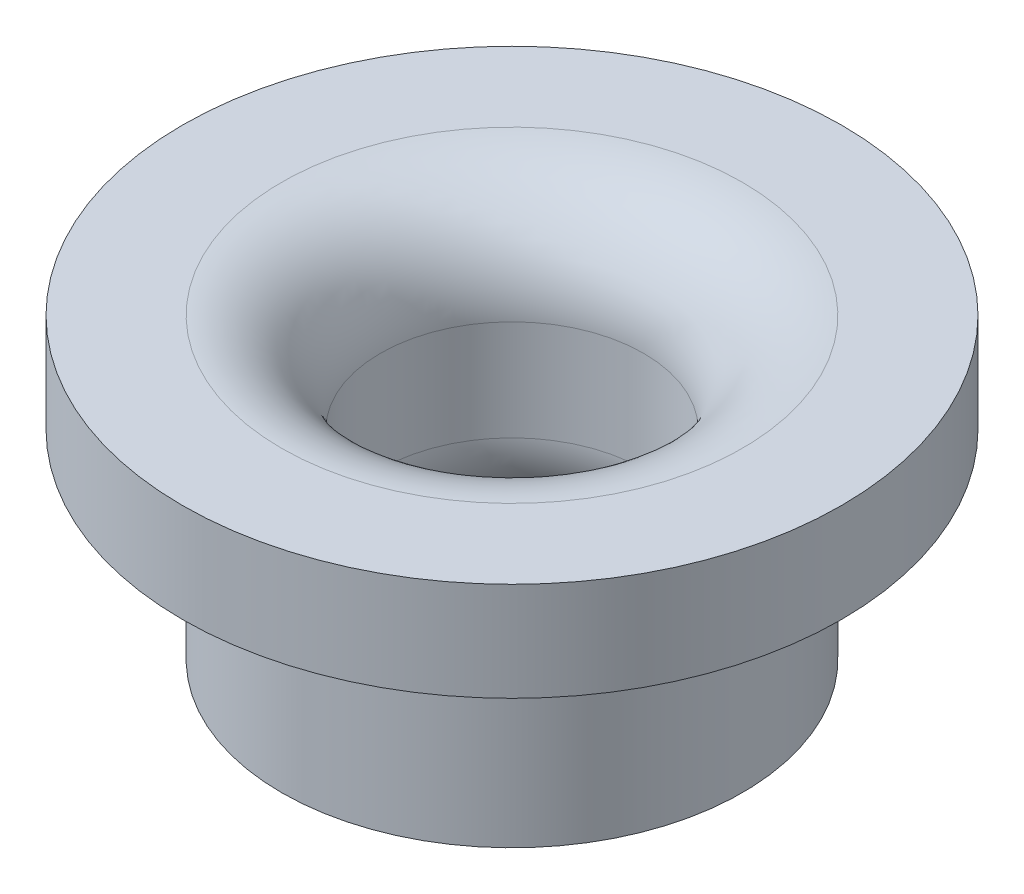
ISO-10303-21;
HEADER;
FILE_DESCRIPTION(('STEP AP214'),'2;1');
FILE_NAME('part.step','',(''),(''),'','','');
FILE_SCHEMA(('AUTOMOTIVE_DESIGN { 1 0 10303 214 1 1 1 1 }'));
ENDSEC;
DATA;
#1=APPLICATION_CONTEXT('core data for automotive mechanical design processes');
#2=APPLICATION_PROTOCOL_DEFINITION('international standard','automotive_design',2000,#1);
#3=PRODUCT_CONTEXT('',#1,'mechanical');
#4=PRODUCT('Part','Part','',(#3));
#5=PRODUCT_RELATED_PRODUCT_CATEGORY('part','',(#4));
#6=PRODUCT_DEFINITION_FORMATION('','',#4);
#7=PRODUCT_DEFINITION_CONTEXT('part definition',#1,'design');
#8=PRODUCT_DEFINITION('design','',#6,#7);
#9=PRODUCT_DEFINITION_SHAPE('','',#8);
#10=(LENGTH_UNIT() NAMED_UNIT(*) SI_UNIT(.MILLI.,.METRE.));
#11=(NAMED_UNIT(*) PLANE_ANGLE_UNIT() SI_UNIT($,.RADIAN.));
#12=(NAMED_UNIT(*) SI_UNIT($,.STERADIAN.) SOLID_ANGLE_UNIT());
#13=UNCERTAINTY_MEASURE_WITH_UNIT(LENGTH_MEASURE(1.E-05),#10,'distance_accuracy_value','');
#14=(GEOMETRIC_REPRESENTATION_CONTEXT(3) GLOBAL_UNCERTAINTY_ASSIGNED_CONTEXT((#13)) GLOBAL_UNIT_ASSIGNED_CONTEXT((#10,
#11,#12)) REPRESENTATION_CONTEXT('',''));
#15=CARTESIAN_POINT('',(0.,0.,0.));
#16=DIRECTION('',(0.,0.,1.));
#17=DIRECTION('',(1.,0.,0.));
#18=AXIS2_PLACEMENT_3D('',#15,#16,#17);
#19=CARTESIAN_POINT('',(-20.,-220.728989873223,-16.57));
#20=DIRECTION('',(0.,1.,0.));
#21=DIRECTION('',(0.,0.,1.));
#22=AXIS2_PLACEMENT_3D('',#19,#20,#21);
#23=CYLINDRICAL_SURFACE('',#22,7.);
#24=CARTESIAN_POINT('',(-20.,-197.93,-16.57));
#25=DIRECTION('',(0.,1.,0.));
#26=DIRECTION('',(0.,0.,1.));
#27=AXIS2_PLACEMENT_3D('',#24,#25,#26);
#28=CIRCLE('',#27,7.);
#29=CARTESIAN_POINT('',(-20.,-197.93,-9.57));
#30=VERTEX_POINT('',#29);
#31=EDGE_CURVE('E56',#30,#30,#28,.F.);
#32=ORIENTED_EDGE('',*,*,#31,.F.);
#33=EDGE_LOOP('',(#32));
#34=FACE_BOUND('',#33,.T.);
#35=CARTESIAN_POINT('',(-20.,-191.87,-16.57));
#36=DIRECTION('',(0.,1.,0.));
#37=DIRECTION('',(0.,0.,1.));
#38=AXIS2_PLACEMENT_3D('',#35,#36,#37);
#39=CIRCLE('',#38,7.);
#40=CARTESIAN_POINT('',(-20.,-191.87,-9.57));
#41=VERTEX_POINT('',#40);
#42=EDGE_CURVE('E61',#41,#41,#39,.F.);
#43=ORIENTED_EDGE('',*,*,#42,.T.);
#44=EDGE_LOOP('',(#43));
#45=FACE_BOUND('',#44,.T.);
#46=ADVANCED_FACE('F41',(#34,#45),#23,.T.);
#47=CARTESIAN_POINT('',(-20.,-220.728989873223,-16.57));
#48=DIRECTION('',(0.,1.,0.));
#49=DIRECTION('',(0.,0.,1.));
#50=AXIS2_PLACEMENT_3D('',#47,#48,#49);
#51=CYLINDRICAL_SURFACE('',#50,4.01);
#52=CARTESIAN_POINT('',(-20.,-194.930016666713,-16.57));
#53=DIRECTION('',(0.,-1.,0.));
#54=DIRECTION('',(0.,0.,-1.));
#55=AXIS2_PLACEMENT_3D('',#52,#53,#54);
#56=CIRCLE('',#55,4.01);
#57=CARTESIAN_POINT('',(-20.,-194.930016666713,-20.58));
#58=VERTEX_POINT('',#57);
#59=EDGE_CURVE('E48',#58,#58,#56,.T.);
#60=ORIENTED_EDGE('',*,*,#59,.T.);
#61=EDGE_LOOP('',(#60));
#62=FACE_BOUND('',#61,.T.);
#63=CARTESIAN_POINT('',(-20.,-191.87,-16.57));
#64=DIRECTION('',(0.,1.,0.));
#65=DIRECTION('',(0.,0.,1.));
#66=AXIS2_PLACEMENT_3D('',#63,#64,#65);
#67=CIRCLE('',#66,4.01);
#68=CARTESIAN_POINT('',(-20.,-191.87,-12.56));
#69=VERTEX_POINT('',#68);
#70=EDGE_CURVE('E52',#69,#69,#67,.F.);
#71=ORIENTED_EDGE('',*,*,#70,.F.);
#72=EDGE_LOOP('',(#71));
#73=FACE_BOUND('',#72,.T.);
#74=ADVANCED_FACE('F87',(#62,#73),#51,.F.);
#75=CARTESIAN_POINT('',(-20.,-191.87,-16.57));
#76=DIRECTION('',(0.,1.,0.));
#77=DIRECTION('',(0.,0.,1.));
#78=AXIS2_PLACEMENT_3D('',#75,#76,#77);
#79=PLANE('',#78);
#80=CARTESIAN_POINT('',(-20.,-191.87,-16.57));
#81=DIRECTION('',(0.,1.,0.));
#82=DIRECTION('',(0.,0.,1.));
#83=AXIS2_PLACEMENT_3D('',#80,#81,#82);
#84=CIRCLE('',#83,4.);
#85=CARTESIAN_POINT('',(-20.,-191.87,-12.57));
#86=VERTEX_POINT('',#85);
#87=EDGE_CURVE('E68',#86,#86,#84,.T.);
#88=ORIENTED_EDGE('',*,*,#87,.T.);
#89=EDGE_LOOP('',(#88));
#90=FACE_BOUND('',#89,.T.);
#91=ORIENTED_EDGE('',*,*,#70,.T.);
#92=EDGE_LOOP('',(#91));
#93=FACE_BOUND('',#92,.T.);
#94=ADVANCED_FACE('F74',(#90,#93),#79,.F.);
#95=CARTESIAN_POINT('',(-20.,-188.87,-16.57));
#96=DIRECTION('',(0.,1.,0.));
#97=DIRECTION('',(0.,0.,1.));
#98=AXIS2_PLACEMENT_3D('',#95,#96,#97);
#99=PLANE('',#98);
#100=CARTESIAN_POINT('',(-20.,-188.87,-16.57));
#101=DIRECTION('',(0.,1.,0.));
#102=DIRECTION('',(0.,0.,1.));
#103=AXIS2_PLACEMENT_3D('',#100,#101,#102);
#104=CIRCLE('',#103,7.);
#105=CARTESIAN_POINT('',(-20.,-188.87,-9.57));
#106=VERTEX_POINT('',#105);
#107=EDGE_CURVE('E10',#106,#106,#104,.F.);
#108=ORIENTED_EDGE('',*,*,#107,.T.);
#109=EDGE_LOOP('',(#108));
#110=FACE_BOUND('',#109,.T.);
#111=CARTESIAN_POINT('',(-20.,-188.87,-16.57));
#112=DIRECTION('',(0.,1.,0.));
#113=DIRECTION('',(0.,0.,1.));
#114=AXIS2_PLACEMENT_3D('',#111,#112,#113);
#115=CIRCLE('',#114,10.01);
#116=CARTESIAN_POINT('',(-20.,-188.87,-6.56));
#117=VERTEX_POINT('',#116);
#118=EDGE_CURVE('E64',#117,#117,#115,.T.);
#119=ORIENTED_EDGE('',*,*,#118,.T.);
#120=EDGE_LOOP('',(#119));
#121=FACE_BOUND('',#120,.T.);
#122=ADVANCED_FACE('F98',(#110,#121),#99,.T.);
#123=ORIENTED_EDGE('',*,*,#42,.F.);
#124=EDGE_LOOP('',(#123));
#125=FACE_BOUND('',#124,.T.);
#126=CARTESIAN_POINT('',(-20.,-191.87,-16.57));
#127=DIRECTION('',(0.,1.,0.));
#128=DIRECTION('',(0.,0.,1.));
#129=AXIS2_PLACEMENT_3D('',#126,#127,#128);
#130=CIRCLE('',#129,10.01);
#131=CARTESIAN_POINT('',(-20.,-191.87,-6.56));
#132=VERTEX_POINT('',#131);
#133=EDGE_CURVE('E65',#132,#132,#130,.T.);
#134=ORIENTED_EDGE('',*,*,#133,.F.);
#135=EDGE_LOOP('',(#134));
#136=FACE_BOUND('',#135,.T.);
#137=ADVANCED_FACE('F101',(#125,#136),#79,.F.);
#138=CARTESIAN_POINT('',(-20.,-188.87,-16.57));
#139=DIRECTION('',(0.,-1.,0.));
#140=DIRECTION('',(0.,0.,-1.));
#141=AXIS2_PLACEMENT_3D('',#138,#139,#140);
#142=CYLINDRICAL_SURFACE('',#141,10.01);
#143=ORIENTED_EDGE('',*,*,#118,.F.);
#144=EDGE_LOOP('',(#143));
#145=FACE_BOUND('',#144,.T.);
#146=ORIENTED_EDGE('',*,*,#133,.T.);
#147=EDGE_LOOP('',(#146));
#148=FACE_BOUND('',#147,.T.);
#149=ADVANCED_FACE('F84',(#145,#148),#142,.T.);
#150=CARTESIAN_POINT('',(-20.,-194.930016666713,-16.57));
#151=DIRECTION('',(0.,-1.,0.));
#152=DIRECTION('',(0.,0.,-1.));
#153=AXIS2_PLACEMENT_3D('',#150,#151,#152);
#154=TOROIDAL_SURFACE('',#153,7.01,3.);
#155=ORIENTED_EDGE('',*,*,#31,.T.);
#156=EDGE_LOOP('',(#155));
#157=FACE_BOUND('',#156,.T.);
#158=ORIENTED_EDGE('',*,*,#59,.F.);
#159=EDGE_LOOP('',(#158));
#160=FACE_BOUND('',#159,.T.);
#161=ADVANCED_FACE('F78',(#157,#160),#154,.T.);
#162=CARTESIAN_POINT('',(-20.,-191.87,-16.57));
#163=DIRECTION('',(0.,1.,0.));
#164=DIRECTION('',(0.,0.,1.));
#165=AXIS2_PLACEMENT_3D('',#162,#163,#164);
#166=TOROIDAL_SURFACE('',#165,7.,3.);
#167=ORIENTED_EDGE('',*,*,#107,.F.);
#168=EDGE_LOOP('',(#167));
#169=FACE_BOUND('',#168,.T.);
#170=ORIENTED_EDGE('',*,*,#87,.F.);
#171=EDGE_LOOP('',(#170));
#172=FACE_BOUND('',#171,.T.);
#173=ADVANCED_FACE('F43',(#169,#172),#166,.T.);
#174=CLOSED_SHELL('',(#46,#74,#94,#122,#137,#149,#161,#173));
#175=MANIFOLD_SOLID_BREP('B2',#174);
#176=ADVANCED_BREP_SHAPE_REPRESENTATION('',(#18,#175),#14);
#177=SHAPE_DEFINITION_REPRESENTATION(#9,#176);
ENDSEC;
END-ISO-10303-21;
